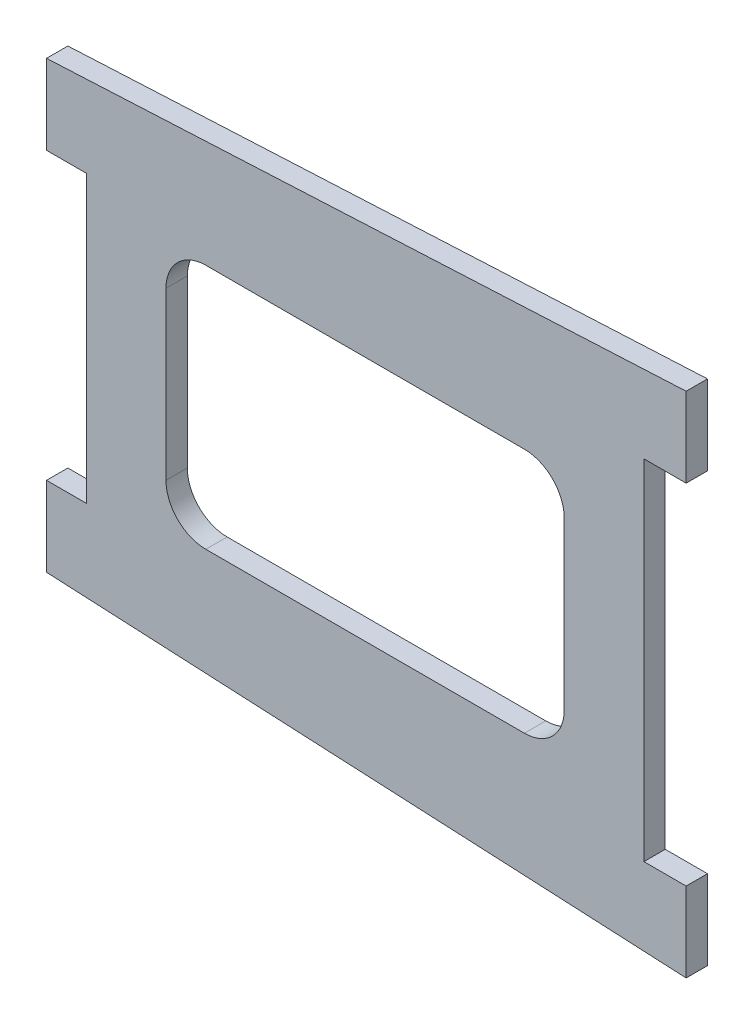
ISO-10303-21;
HEADER;
FILE_DESCRIPTION(('STEP AP214'),'2;1');
FILE_NAME('part.step','',(''),(''),'','','');
FILE_SCHEMA(('AUTOMOTIVE_DESIGN { 1 0 10303 214 1 1 1 1 }'));
ENDSEC;
DATA;
#1=APPLICATION_CONTEXT('core data for automotive mechanical design processes');
#2=APPLICATION_PROTOCOL_DEFINITION('international standard','automotive_design',2000,#1);
#3=PRODUCT_CONTEXT('',#1,'mechanical');
#4=PRODUCT('Part','Part','',(#3));
#5=PRODUCT_RELATED_PRODUCT_CATEGORY('part','',(#4));
#6=PRODUCT_DEFINITION_FORMATION('','',#4);
#7=PRODUCT_DEFINITION_CONTEXT('part definition',#1,'design');
#8=PRODUCT_DEFINITION('design','',#6,#7);
#9=PRODUCT_DEFINITION_SHAPE('','',#8);
#10=(LENGTH_UNIT() NAMED_UNIT(*) SI_UNIT(.MILLI.,.METRE.));
#11=(NAMED_UNIT(*) PLANE_ANGLE_UNIT() SI_UNIT($,.RADIAN.));
#12=(NAMED_UNIT(*) SI_UNIT($,.STERADIAN.) SOLID_ANGLE_UNIT());
#13=UNCERTAINTY_MEASURE_WITH_UNIT(LENGTH_MEASURE(1.E-05),#10,'distance_accuracy_value','');
#14=(GEOMETRIC_REPRESENTATION_CONTEXT(3) GLOBAL_UNCERTAINTY_ASSIGNED_CONTEXT((#13)) GLOBAL_UNIT_ASSIGNED_CONTEXT((#10,
#11,#12)) REPRESENTATION_CONTEXT('',''));
#15=CARTESIAN_POINT('',(0.,0.,0.));
#16=DIRECTION('',(0.,0.,1.));
#17=DIRECTION('',(1.,0.,0.));
#18=AXIS2_PLACEMENT_3D('',#15,#16,#17);
#19=CARTESIAN_POINT('',(0.,0.,3.4036));
#20=DIRECTION('',(0.,0.,-1.));
#21=DIRECTION('',(-1.,0.,0.));
#22=AXIS2_PLACEMENT_3D('',#19,#20,#21);
#23=PLANE('',#22);
#24=DIRECTION('',(-2.79741234551227E-13,1.,0.));
#25=VECTOR('',#24,1.);
#26=CARTESIAN_POINT('',(8689.6367599168,2967.0500559894,3.4036));
#27=LINE('',#26,#25);
#28=CARTESIAN_POINT('',(8689.6367599168,2967.0500559894,3.4036));
#29=VERTEX_POINT('',#28);
#30=CARTESIAN_POINT('',(8689.63675991679,2979.7500559894,3.4036));
#31=VERTEX_POINT('',#30);
#32=EDGE_CURVE('E239',#29,#31,#27,.T.);
#33=ORIENTED_EDGE('',*,*,#32,.T.);
#34=DIRECTION('',(-0.998786405241264,-0.0492515655104793,0.));
#35=VECTOR('',#34,1.);
#36=CARTESIAN_POINT('',(8689.63675991679,2979.7500559894,3.4036));
#37=LINE('',#36,#35);
#38=CARTESIAN_POINT('',(8587.6481929103,2974.7208559894,3.4036));
#39=VERTEX_POINT('',#38);
#40=EDGE_CURVE('E242',#31,#39,#37,.T.);
#41=ORIENTED_EDGE('',*,*,#40,.T.);
#42=DIRECTION('',(-2.79741234551227E-13,-1.,0.));
#43=VECTOR('',#42,1.);
#44=CARTESIAN_POINT('',(8587.64819291029,2962.0208559894,3.4036));
#45=LINE('',#44,#43);
#46=CARTESIAN_POINT('',(8587.64819291029,2962.0208559894,3.4036));
#47=VERTEX_POINT('',#46);
#48=EDGE_CURVE('E245',#39,#47,#45,.T.);
#49=ORIENTED_EDGE('',*,*,#48,.T.);
#50=DIRECTION('',(1.,0.,0.));
#51=VECTOR('',#50,1.);
#52=CARTESIAN_POINT('',(8587.64819291029,2962.0208559894,3.4036));
#53=LINE('',#52,#51);
#54=CARTESIAN_POINT('',(8593.99819291029,2962.0208559894,3.4036));
#55=VERTEX_POINT('',#54);
#56=EDGE_CURVE('E247',#47,#55,#53,.T.);
#57=ORIENTED_EDGE('',*,*,#56,.T.);
#58=DIRECTION('',(0.,-1.,0.));
#59=VECTOR('',#58,1.);
#60=CARTESIAN_POINT('',(8593.99819291029,2962.0208559894,3.4036));
#61=LINE('',#60,#59);
#62=CARTESIAN_POINT('',(8593.99819291029,2916.4532559894,3.4036));
#63=VERTEX_POINT('',#62);
#64=EDGE_CURVE('E249',#55,#63,#61,.T.);
#65=ORIENTED_EDGE('',*,*,#64,.T.);
#66=DIRECTION('',(-1.,0.,0.));
#67=VECTOR('',#66,1.);
#68=CARTESIAN_POINT('',(8587.64819291029,2916.4532559894,3.4036));
#69=LINE('',#68,#67);
#70=CARTESIAN_POINT('',(8587.64819291029,2916.4532559894,3.4036));
#71=VERTEX_POINT('',#70);
#72=EDGE_CURVE('E251',#63,#71,#69,.T.);
#73=ORIENTED_EDGE('',*,*,#72,.T.);
#74=DIRECTION('',(2.79741234551217E-13,-1.,0.));
#75=VECTOR('',#74,1.);
#76=CARTESIAN_POINT('',(8587.64819291029,2916.4532559894,3.4036));
#77=LINE('',#76,#75);
#78=CARTESIAN_POINT('',(8587.6481929103,2903.7532559894,3.4036));
#79=VERTEX_POINT('',#78);
#80=EDGE_CURVE('E253',#71,#79,#77,.T.);
#81=ORIENTED_EDGE('',*,*,#80,.T.);
#82=DIRECTION('',(0.998786405241264,-0.0492515655104793,0.));
#83=VECTOR('',#82,1.);
#84=CARTESIAN_POINT('',(8689.63675991679,2898.72405598939,3.4036));
#85=LINE('',#84,#83);
#86=CARTESIAN_POINT('',(8689.63675991679,2898.72405598939,3.4036));
#87=VERTEX_POINT('',#86);
#88=EDGE_CURVE('E255',#79,#87,#85,.T.);
#89=ORIENTED_EDGE('',*,*,#88,.T.);
#90=DIRECTION('',(2.79741234551217E-13,1.,0.));
#91=VECTOR('',#90,1.);
#92=CARTESIAN_POINT('',(8689.6367599168,2911.4240559894,3.4036));
#93=LINE('',#92,#91);
#94=CARTESIAN_POINT('',(8689.6367599168,2911.4240559894,3.4036));
#95=VERTEX_POINT('',#94);
#96=EDGE_CURVE('E257',#87,#95,#93,.T.);
#97=ORIENTED_EDGE('',*,*,#96,.T.);
#98=DIRECTION('',(-1.,0.,0.));
#99=VECTOR('',#98,1.);
#100=CARTESIAN_POINT('',(8689.6367599168,2911.4240559894,3.4036));
#101=LINE('',#100,#99);
#102=CARTESIAN_POINT('',(8682.8981929103,2911.4240559894,3.4036));
#103=VERTEX_POINT('',#102);
#104=EDGE_CURVE('E259',#95,#103,#101,.T.);
#105=ORIENTED_EDGE('',*,*,#104,.T.);
#106=DIRECTION('',(-1.27735723539367E-13,1.,0.));
#107=VECTOR('',#106,1.);
#108=CARTESIAN_POINT('',(8682.89819291029,2967.0500559894,3.4036));
#109=LINE('',#108,#107);
#110=CARTESIAN_POINT('',(8682.89819291029,2967.0500559894,3.4036));
#111=VERTEX_POINT('',#110);
#112=EDGE_CURVE('E261',#103,#111,#109,.T.);
#113=ORIENTED_EDGE('',*,*,#112,.T.);
#114=DIRECTION('',(1.,0.,0.));
#115=VECTOR('',#114,1.);
#116=CARTESIAN_POINT('',(8689.6367599168,2967.0500559894,3.4036));
#117=LINE('',#116,#115);
#118=EDGE_CURVE('E263',#111,#29,#117,.T.);
#119=ORIENTED_EDGE('',*,*,#118,.T.);
#120=EDGE_LOOP('',(#33,#41,#49,#57,#65,#73,#81,#89,#97,#105,#113,#119));
#121=FACE_BOUND('',#120,.T.);
#122=CARTESIAN_POINT('',(8613.0481929103,2952.4958559894,3.4036));
#123=DIRECTION('',(0.,0.,1.));
#124=DIRECTION('',(1.,0.,0.));
#125=AXIS2_PLACEMENT_3D('',#122,#123,#124);
#126=CIRCLE('',#125,6.34999999999963);
#127=CARTESIAN_POINT('',(8613.0481929103,2958.8458559894,3.4036));
#128=VERTEX_POINT('',#127);
#129=CARTESIAN_POINT('',(8606.69819291029,2952.4958559894,3.4036));
#130=VERTEX_POINT('',#129);
#131=EDGE_CURVE('E174',#128,#130,#126,.T.);
#132=ORIENTED_EDGE('',*,*,#131,.F.);
#133=DIRECTION('',(-1.,0.,0.));
#134=VECTOR('',#133,1.);
#135=CARTESIAN_POINT('',(8613.0481929103,2958.8458559894,3.4036));
#136=LINE('',#135,#134);
#137=CARTESIAN_POINT('',(8663.8481929103,2958.8458559894,3.4036));
#138=VERTEX_POINT('',#137);
#139=EDGE_CURVE('E207',#138,#128,#136,.T.);
#140=ORIENTED_EDGE('',*,*,#139,.F.);
#141=CARTESIAN_POINT('',(8663.8481929103,2952.4958559894,3.4036));
#142=DIRECTION('',(0.,0.,1.));
#143=DIRECTION('',(1.,0.,0.));
#144=AXIS2_PLACEMENT_3D('',#141,#142,#143);
#145=CIRCLE('',#144,6.34999999999963);
#146=CARTESIAN_POINT('',(8670.19819291029,2952.4958559894,3.4036));
#147=VERTEX_POINT('',#146);
#148=EDGE_CURVE('E205',#147,#138,#145,.T.);
#149=ORIENTED_EDGE('',*,*,#148,.F.);
#150=DIRECTION('',(0.,1.,0.));
#151=VECTOR('',#150,1.);
#152=CARTESIAN_POINT('',(8670.19819291029,2952.4958559894,3.4036));
#153=LINE('',#152,#151);
#154=CARTESIAN_POINT('',(8670.19819291029,2925.9782559894,3.4036));
#155=VERTEX_POINT('',#154);
#156=EDGE_CURVE('E203',#155,#147,#153,.T.);
#157=ORIENTED_EDGE('',*,*,#156,.F.);
#158=CARTESIAN_POINT('',(8663.8481929103,2925.9782559894,3.4036));
#159=DIRECTION('',(0.,0.,1.));
#160=DIRECTION('',(1.,0.,0.));
#161=AXIS2_PLACEMENT_3D('',#158,#159,#160);
#162=CIRCLE('',#161,6.34999999999986);
#163=CARTESIAN_POINT('',(8663.8481929103,2919.6282559894,3.4036));
#164=VERTEX_POINT('',#163);
#165=EDGE_CURVE('E201',#164,#155,#162,.T.);
#166=ORIENTED_EDGE('',*,*,#165,.F.);
#167=DIRECTION('',(1.,0.,0.));
#168=VECTOR('',#167,1.);
#169=CARTESIAN_POINT('',(8663.8481929103,2919.6282559894,3.4036));
#170=LINE('',#169,#168);
#171=CARTESIAN_POINT('',(8613.0481929103,2919.6282559894,3.4036));
#172=VERTEX_POINT('',#171);
#173=EDGE_CURVE('E197',#172,#164,#170,.T.);
#174=ORIENTED_EDGE('',*,*,#173,.F.);
#175=CARTESIAN_POINT('',(8613.0481929103,2925.9782559894,3.4036));
#176=DIRECTION('',(0.,0.,1.));
#177=DIRECTION('',(1.,0.,0.));
#178=AXIS2_PLACEMENT_3D('',#175,#176,#177);
#179=CIRCLE('',#178,6.34999999999986);
#180=CARTESIAN_POINT('',(8606.69819291029,2925.9782559894,3.4036));
#181=VERTEX_POINT('',#180);
#182=EDGE_CURVE('E195',#181,#172,#179,.T.);
#183=ORIENTED_EDGE('',*,*,#182,.F.);
#184=DIRECTION('',(0.,-1.,0.));
#185=VECTOR('',#184,1.);
#186=CARTESIAN_POINT('',(8606.69819291029,2952.4958559894,3.4036));
#187=LINE('',#186,#185);
#188=EDGE_CURVE('E182',#130,#181,#187,.T.);
#189=ORIENTED_EDGE('',*,*,#188,.F.);
#190=EDGE_LOOP('',(#132,#140,#149,#157,#166,#174,#183,#189));
#191=FACE_BOUND('',#190,.T.);
#192=ADVANCED_FACE('F37',(#121,#191),#23,.F.);
#193=CARTESIAN_POINT('',(0.,0.,0.));
#194=DIRECTION('',(0.,0.,-1.));
#195=DIRECTION('',(-1.,0.,0.));
#196=AXIS2_PLACEMENT_3D('',#193,#194,#195);
#197=PLANE('',#196);
#198=DIRECTION('',(-2.79741234551227E-13,1.,0.));
#199=VECTOR('',#198,1.);
#200=CARTESIAN_POINT('',(8689.6367599168,2967.0500559894,0.));
#201=LINE('',#200,#199);
#202=CARTESIAN_POINT('',(8689.6367599168,2967.0500559894,0.));
#203=VERTEX_POINT('',#202);
#204=CARTESIAN_POINT('',(8689.63675991679,2979.7500559894,0.));
#205=VERTEX_POINT('',#204);
#206=EDGE_CURVE('E190',#203,#205,#201,.T.);
#207=ORIENTED_EDGE('',*,*,#206,.F.);
#208=DIRECTION('',(1.,0.,0.));
#209=VECTOR('',#208,1.);
#210=CARTESIAN_POINT('',(8689.6367599168,2967.0500559894,0.));
#211=LINE('',#210,#209);
#212=CARTESIAN_POINT('',(8682.89819291029,2967.0500559894,0.));
#213=VERTEX_POINT('',#212);
#214=EDGE_CURVE('E243',#213,#203,#211,.T.);
#215=ORIENTED_EDGE('',*,*,#214,.F.);
#216=DIRECTION('',(-1.27735723539367E-13,1.,0.));
#217=VECTOR('',#216,1.);
#218=CARTESIAN_POINT('',(8682.89819291029,2967.0500559894,0.));
#219=LINE('',#218,#217);
#220=CARTESIAN_POINT('',(8682.8981929103,2911.4240559894,0.));
#221=VERTEX_POINT('',#220);
#222=EDGE_CURVE('E286',#221,#213,#219,.T.);
#223=ORIENTED_EDGE('',*,*,#222,.F.);
#224=DIRECTION('',(-1.,0.,0.));
#225=VECTOR('',#224,1.);
#226=CARTESIAN_POINT('',(8689.6367599168,2911.4240559894,0.));
#227=LINE('',#226,#225);
#228=CARTESIAN_POINT('',(8689.6367599168,2911.4240559894,0.));
#229=VERTEX_POINT('',#228);
#230=EDGE_CURVE('E284',#229,#221,#227,.T.);
#231=ORIENTED_EDGE('',*,*,#230,.F.);
#232=DIRECTION('',(2.79741234551217E-13,1.,0.));
#233=VECTOR('',#232,1.);
#234=CARTESIAN_POINT('',(8689.6367599168,2911.4240559894,0.));
#235=LINE('',#234,#233);
#236=CARTESIAN_POINT('',(8689.63675991679,2898.72405598939,0.));
#237=VERTEX_POINT('',#236);
#238=EDGE_CURVE('E282',#237,#229,#235,.T.);
#239=ORIENTED_EDGE('',*,*,#238,.F.);
#240=DIRECTION('',(0.998786405241264,-0.0492515655104793,0.));
#241=VECTOR('',#240,1.);
#242=CARTESIAN_POINT('',(8689.63675991679,2898.72405598939,0.));
#243=LINE('',#242,#241);
#244=CARTESIAN_POINT('',(8587.6481929103,2903.7532559894,0.));
#245=VERTEX_POINT('',#244);
#246=EDGE_CURVE('E280',#245,#237,#243,.T.);
#247=ORIENTED_EDGE('',*,*,#246,.F.);
#248=DIRECTION('',(2.79741234551217E-13,-1.,0.));
#249=VECTOR('',#248,1.);
#250=CARTESIAN_POINT('',(8587.64819291029,2916.4532559894,0.));
#251=LINE('',#250,#249);
#252=CARTESIAN_POINT('',(8587.64819291029,2916.4532559894,0.));
#253=VERTEX_POINT('',#252);
#254=EDGE_CURVE('E278',#253,#245,#251,.T.);
#255=ORIENTED_EDGE('',*,*,#254,.F.);
#256=DIRECTION('',(-1.,0.,0.));
#257=VECTOR('',#256,1.);
#258=CARTESIAN_POINT('',(8587.64819291029,2916.4532559894,0.));
#259=LINE('',#258,#257);
#260=CARTESIAN_POINT('',(8593.99819291029,2916.4532559894,0.));
#261=VERTEX_POINT('',#260);
#262=EDGE_CURVE('E276',#261,#253,#259,.T.);
#263=ORIENTED_EDGE('',*,*,#262,.F.);
#264=DIRECTION('',(0.,-1.,0.));
#265=VECTOR('',#264,1.);
#266=CARTESIAN_POINT('',(8593.99819291029,2962.0208559894,0.));
#267=LINE('',#266,#265);
#268=CARTESIAN_POINT('',(8593.99819291029,2962.0208559894,0.));
#269=VERTEX_POINT('',#268);
#270=EDGE_CURVE('E274',#269,#261,#267,.T.);
#271=ORIENTED_EDGE('',*,*,#270,.F.);
#272=DIRECTION('',(1.,0.,0.));
#273=VECTOR('',#272,1.);
#274=CARTESIAN_POINT('',(8587.64819291029,2962.0208559894,0.));
#275=LINE('',#274,#273);
#276=CARTESIAN_POINT('',(8587.64819291029,2962.0208559894,0.));
#277=VERTEX_POINT('',#276);
#278=EDGE_CURVE('E272',#277,#269,#275,.T.);
#279=ORIENTED_EDGE('',*,*,#278,.F.);
#280=DIRECTION('',(-2.79741234551227E-13,-1.,0.));
#281=VECTOR('',#280,1.);
#282=CARTESIAN_POINT('',(8587.64819291029,2962.0208559894,0.));
#283=LINE('',#282,#281);
#284=CARTESIAN_POINT('',(8587.6481929103,2974.7208559894,0.));
#285=VERTEX_POINT('',#284);
#286=EDGE_CURVE('E270',#285,#277,#283,.T.);
#287=ORIENTED_EDGE('',*,*,#286,.F.);
#288=DIRECTION('',(-0.998786405241264,-0.0492515655104793,0.));
#289=VECTOR('',#288,1.);
#290=CARTESIAN_POINT('',(8689.63675991679,2979.7500559894,0.));
#291=LINE('',#290,#289);
#292=EDGE_CURVE('E268',#205,#285,#291,.T.);
#293=ORIENTED_EDGE('',*,*,#292,.F.);
#294=EDGE_LOOP('',(#207,#215,#223,#231,#239,#247,#255,#263,#271,#279,#287,#293));
#295=FACE_BOUND('',#294,.T.);
#296=DIRECTION('',(-1.,0.,0.));
#297=VECTOR('',#296,1.);
#298=CARTESIAN_POINT('',(8613.0481929103,2958.8458559894,0.));
#299=LINE('',#298,#297);
#300=CARTESIAN_POINT('',(8663.8481929103,2958.8458559894,0.));
#301=VERTEX_POINT('',#300);
#302=CARTESIAN_POINT('',(8613.0481929103,2958.8458559894,0.));
#303=VERTEX_POINT('',#302);
#304=EDGE_CURVE('E183',#301,#303,#299,.T.);
#305=ORIENTED_EDGE('',*,*,#304,.T.);
#306=CARTESIAN_POINT('',(8613.0481929103,2952.4958559894,0.));
#307=DIRECTION('',(0.,0.,1.));
#308=DIRECTION('',(1.,0.,0.));
#309=AXIS2_PLACEMENT_3D('',#306,#307,#308);
#310=CIRCLE('',#309,6.34999999999963);
#311=CARTESIAN_POINT('',(8606.69819291029,2952.4958559894,0.));
#312=VERTEX_POINT('',#311);
#313=EDGE_CURVE('E60',#303,#312,#310,.T.);
#314=ORIENTED_EDGE('',*,*,#313,.T.);
#315=DIRECTION('',(0.,-1.,0.));
#316=VECTOR('',#315,1.);
#317=CARTESIAN_POINT('',(8606.69819291029,2952.4958559894,0.));
#318=LINE('',#317,#316);
#319=CARTESIAN_POINT('',(8606.69819291029,2925.9782559894,0.));
#320=VERTEX_POINT('',#319);
#321=EDGE_CURVE('E189',#312,#320,#318,.T.);
#322=ORIENTED_EDGE('',*,*,#321,.T.);
#323=CARTESIAN_POINT('',(8613.0481929103,2925.9782559894,0.));
#324=DIRECTION('',(0.,0.,1.));
#325=DIRECTION('',(1.,0.,0.));
#326=AXIS2_PLACEMENT_3D('',#323,#324,#325);
#327=CIRCLE('',#326,6.34999999999986);
#328=CARTESIAN_POINT('',(8613.0481929103,2919.6282559894,0.));
#329=VERTEX_POINT('',#328);
#330=EDGE_CURVE('E211',#320,#329,#327,.T.);
#331=ORIENTED_EDGE('',*,*,#330,.T.);
#332=DIRECTION('',(1.,0.,0.));
#333=VECTOR('',#332,1.);
#334=CARTESIAN_POINT('',(8663.8481929103,2919.6282559894,0.));
#335=LINE('',#334,#333);
#336=CARTESIAN_POINT('',(8663.8481929103,2919.6282559894,0.));
#337=VERTEX_POINT('',#336);
#338=EDGE_CURVE('E214',#329,#337,#335,.T.);
#339=ORIENTED_EDGE('',*,*,#338,.T.);
#340=CARTESIAN_POINT('',(8663.8481929103,2925.9782559894,0.));
#341=DIRECTION('',(0.,0.,1.));
#342=DIRECTION('',(1.,0.,0.));
#343=AXIS2_PLACEMENT_3D('',#340,#341,#342);
#344=CIRCLE('',#343,6.34999999999986);
#345=CARTESIAN_POINT('',(8670.19819291029,2925.9782559894,0.));
#346=VERTEX_POINT('',#345);
#347=EDGE_CURVE('E217',#337,#346,#344,.T.);
#348=ORIENTED_EDGE('',*,*,#347,.T.);
#349=DIRECTION('',(0.,1.,0.));
#350=VECTOR('',#349,1.);
#351=CARTESIAN_POINT('',(8670.19819291029,2952.4958559894,0.));
#352=LINE('',#351,#350);
#353=CARTESIAN_POINT('',(8670.19819291029,2952.4958559894,0.));
#354=VERTEX_POINT('',#353);
#355=EDGE_CURVE('E220',#346,#354,#352,.T.);
#356=ORIENTED_EDGE('',*,*,#355,.T.);
#357=CARTESIAN_POINT('',(8663.8481929103,2952.4958559894,0.));
#358=DIRECTION('',(0.,0.,1.));
#359=DIRECTION('',(1.,0.,0.));
#360=AXIS2_PLACEMENT_3D('',#357,#358,#359);
#361=CIRCLE('',#360,6.34999999999963);
#362=EDGE_CURVE('E223',#354,#301,#361,.T.);
#363=ORIENTED_EDGE('',*,*,#362,.T.);
#364=EDGE_LOOP('',(#305,#314,#322,#331,#339,#348,#356,#363));
#365=FACE_BOUND('',#364,.T.);
#366=ADVANCED_FACE('F328',(#295,#365),#197,.T.);
#367=CARTESIAN_POINT('',(8689.6367599168,2967.0500559894,3.4036));
#368=DIRECTION('',(-1.,-2.79741234551227E-13,0.));
#369=DIRECTION('',(2.79741234551227E-13,-1.,0.));
#370=AXIS2_PLACEMENT_3D('',#367,#368,#369);
#371=PLANE('',#370);
#372=ORIENTED_EDGE('',*,*,#206,.T.);
#373=DIRECTION('',(0.,0.,-1.));
#374=VECTOR('',#373,1.);
#375=CARTESIAN_POINT('',(8689.63675991679,2979.7500559894,3.4036));
#376=LINE('',#375,#374);
#377=EDGE_CURVE('E11',#31,#205,#376,.T.);
#378=ORIENTED_EDGE('',*,*,#377,.F.);
#379=ORIENTED_EDGE('',*,*,#32,.F.);
#380=DIRECTION('',(0.,0.,-1.));
#381=VECTOR('',#380,1.);
#382=CARTESIAN_POINT('',(8689.6367599168,2967.0500559894,3.4036));
#383=LINE('',#382,#381);
#384=EDGE_CURVE('E265',#29,#203,#383,.T.);
#385=ORIENTED_EDGE('',*,*,#384,.T.);
#386=EDGE_LOOP('',(#372,#378,#379,#385));
#387=FACE_BOUND('',#386,.T.);
#388=ADVANCED_FACE('F39',(#387),#371,.F.);
#389=CARTESIAN_POINT('',(8689.63675991679,2979.7500559894,3.4036));
#390=DIRECTION('',(0.0492515655104793,-0.998786405241264,0.));
#391=DIRECTION('',(0.998786405241264,0.0492515655104793,0.));
#392=AXIS2_PLACEMENT_3D('',#389,#390,#391);
#393=PLANE('',#392);
#394=ORIENTED_EDGE('',*,*,#292,.T.);
#395=DIRECTION('',(0.,0.,-1.));
#396=VECTOR('',#395,1.);
#397=CARTESIAN_POINT('',(8587.6481929103,2974.7208559894,3.4036));
#398=LINE('',#397,#396);
#399=EDGE_CURVE('E45',#39,#285,#398,.T.);
#400=ORIENTED_EDGE('',*,*,#399,.F.);
#401=ORIENTED_EDGE('',*,*,#40,.F.);
#402=ORIENTED_EDGE('',*,*,#377,.T.);
#403=EDGE_LOOP('',(#394,#400,#401,#402));
#404=FACE_BOUND('',#403,.T.);
#405=ADVANCED_FACE('F345',(#404),#393,.F.);
#406=CARTESIAN_POINT('',(8587.64819291029,2962.0208559894,3.4036));
#407=DIRECTION('',(1.,-2.79741234551227E-13,0.));
#408=DIRECTION('',(2.79741234551227E-13,1.,0.));
#409=AXIS2_PLACEMENT_3D('',#406,#407,#408);
#410=PLANE('',#409);
#411=ORIENTED_EDGE('',*,*,#286,.T.);
#412=DIRECTION('',(0.,0.,-1.));
#413=VECTOR('',#412,1.);
#414=CARTESIAN_POINT('',(8587.64819291029,2962.0208559894,3.4036));
#415=LINE('',#414,#413);
#416=EDGE_CURVE('E315',#47,#277,#415,.T.);
#417=ORIENTED_EDGE('',*,*,#416,.F.);
#418=ORIENTED_EDGE('',*,*,#48,.F.);
#419=ORIENTED_EDGE('',*,*,#399,.T.);
#420=EDGE_LOOP('',(#411,#417,#418,#419));
#421=FACE_BOUND('',#420,.T.);
#422=ADVANCED_FACE('F322',(#421),#410,.F.);
#423=CARTESIAN_POINT('',(8587.64819291029,2962.0208559894,3.4036));
#424=DIRECTION('',(0.,1.,0.));
#425=DIRECTION('',(0.,0.,1.));
#426=AXIS2_PLACEMENT_3D('',#423,#424,#425);
#427=PLANE('',#426);
#428=ORIENTED_EDGE('',*,*,#278,.T.);
#429=DIRECTION('',(0.,0.,-1.));
#430=VECTOR('',#429,1.);
#431=CARTESIAN_POINT('',(8593.99819291029,2962.0208559894,3.4036));
#432=LINE('',#431,#430);
#433=EDGE_CURVE('E312',#55,#269,#432,.T.);
#434=ORIENTED_EDGE('',*,*,#433,.F.);
#435=ORIENTED_EDGE('',*,*,#56,.F.);
#436=ORIENTED_EDGE('',*,*,#416,.T.);
#437=EDGE_LOOP('',(#428,#434,#435,#436));
#438=FACE_BOUND('',#437,.T.);
#439=ADVANCED_FACE('F334',(#438),#427,.F.);
#440=CARTESIAN_POINT('',(8593.99819291029,2962.0208559894,3.4036));
#441=DIRECTION('',(1.,0.,0.));
#442=DIRECTION('',(0.,0.,-1.));
#443=AXIS2_PLACEMENT_3D('',#440,#441,#442);
#444=PLANE('',#443);
#445=ORIENTED_EDGE('',*,*,#270,.T.);
#446=DIRECTION('',(0.,0.,-1.));
#447=VECTOR('',#446,1.);
#448=CARTESIAN_POINT('',(8593.99819291029,2916.4532559894,3.4036));
#449=LINE('',#448,#447);
#450=EDGE_CURVE('E309',#63,#261,#449,.T.);
#451=ORIENTED_EDGE('',*,*,#450,.F.);
#452=ORIENTED_EDGE('',*,*,#64,.F.);
#453=ORIENTED_EDGE('',*,*,#433,.T.);
#454=EDGE_LOOP('',(#445,#451,#452,#453));
#455=FACE_BOUND('',#454,.T.);
#456=ADVANCED_FACE('F338',(#455),#444,.F.);
#457=CARTESIAN_POINT('',(8587.64819291029,2916.4532559894,3.4036));
#458=DIRECTION('',(0.,-1.,0.));
#459=DIRECTION('',(0.,0.,-1.));
#460=AXIS2_PLACEMENT_3D('',#457,#458,#459);
#461=PLANE('',#460);
#462=ORIENTED_EDGE('',*,*,#262,.T.);
#463=DIRECTION('',(0.,0.,-1.));
#464=VECTOR('',#463,1.);
#465=CARTESIAN_POINT('',(8587.64819291029,2916.4532559894,3.4036));
#466=LINE('',#465,#464);
#467=EDGE_CURVE('E306',#71,#253,#466,.T.);
#468=ORIENTED_EDGE('',*,*,#467,.F.);
#469=ORIENTED_EDGE('',*,*,#72,.F.);
#470=ORIENTED_EDGE('',*,*,#450,.T.);
#471=EDGE_LOOP('',(#462,#468,#469,#470));
#472=FACE_BOUND('',#471,.T.);
#473=ADVANCED_FACE('F378',(#472),#461,.F.);
#474=CARTESIAN_POINT('',(8587.64819291029,2916.4532559894,3.4036));
#475=DIRECTION('',(1.,2.79741234551217E-13,0.));
#476=DIRECTION('',(-2.79741234551217E-13,1.,0.));
#477=AXIS2_PLACEMENT_3D('',#474,#475,#476);
#478=PLANE('',#477);
#479=ORIENTED_EDGE('',*,*,#254,.T.);
#480=DIRECTION('',(0.,0.,-1.));
#481=VECTOR('',#480,1.);
#482=CARTESIAN_POINT('',(8587.6481929103,2903.7532559894,3.4036));
#483=LINE('',#482,#481);
#484=EDGE_CURVE('E303',#79,#245,#483,.T.);
#485=ORIENTED_EDGE('',*,*,#484,.F.);
#486=ORIENTED_EDGE('',*,*,#80,.F.);
#487=ORIENTED_EDGE('',*,*,#467,.T.);
#488=EDGE_LOOP('',(#479,#485,#486,#487));
#489=FACE_BOUND('',#488,.T.);
#490=ADVANCED_FACE('F376',(#489),#478,.F.);
#491=CARTESIAN_POINT('',(8689.63675991679,2898.72405598939,3.4036));
#492=DIRECTION('',(0.0492515655104793,0.998786405241264,0.));
#493=DIRECTION('',(-0.998786405241264,0.0492515655104793,0.));
#494=AXIS2_PLACEMENT_3D('',#491,#492,#493);
#495=PLANE('',#494);
#496=ORIENTED_EDGE('',*,*,#246,.T.);
#497=DIRECTION('',(0.,0.,-1.));
#498=VECTOR('',#497,1.);
#499=CARTESIAN_POINT('',(8689.63675991679,2898.72405598939,3.4036));
#500=LINE('',#499,#498);
#501=EDGE_CURVE('E300',#87,#237,#500,.T.);
#502=ORIENTED_EDGE('',*,*,#501,.F.);
#503=ORIENTED_EDGE('',*,*,#88,.F.);
#504=ORIENTED_EDGE('',*,*,#484,.T.);
#505=EDGE_LOOP('',(#496,#502,#503,#504));
#506=FACE_BOUND('',#505,.T.);
#507=ADVANCED_FACE('F372',(#506),#495,.F.);
#508=CARTESIAN_POINT('',(8689.6367599168,2911.4240559894,3.4036));
#509=DIRECTION('',(-1.,2.79741234551217E-13,0.));
#510=DIRECTION('',(-2.79741234551217E-13,-1.,0.));
#511=AXIS2_PLACEMENT_3D('',#508,#509,#510);
#512=PLANE('',#511);
#513=ORIENTED_EDGE('',*,*,#238,.T.);
#514=DIRECTION('',(0.,0.,-1.));
#515=VECTOR('',#514,1.);
#516=CARTESIAN_POINT('',(8689.6367599168,2911.4240559894,3.4036));
#517=LINE('',#516,#515);
#518=EDGE_CURVE('E297',#95,#229,#517,.T.);
#519=ORIENTED_EDGE('',*,*,#518,.F.);
#520=ORIENTED_EDGE('',*,*,#96,.F.);
#521=ORIENTED_EDGE('',*,*,#501,.T.);
#522=EDGE_LOOP('',(#513,#519,#520,#521));
#523=FACE_BOUND('',#522,.T.);
#524=ADVANCED_FACE('F367',(#523),#512,.F.);
#525=CARTESIAN_POINT('',(8689.6367599168,2911.4240559894,3.4036));
#526=DIRECTION('',(0.,-1.,0.));
#527=DIRECTION('',(0.,0.,-1.));
#528=AXIS2_PLACEMENT_3D('',#525,#526,#527);
#529=PLANE('',#528);
#530=ORIENTED_EDGE('',*,*,#230,.T.);
#531=DIRECTION('',(0.,0.,-1.));
#532=VECTOR('',#531,1.);
#533=CARTESIAN_POINT('',(8682.8981929103,2911.4240559894,3.4036));
#534=LINE('',#533,#532);
#535=EDGE_CURVE('E294',#103,#221,#534,.T.);
#536=ORIENTED_EDGE('',*,*,#535,.F.);
#537=ORIENTED_EDGE('',*,*,#104,.F.);
#538=ORIENTED_EDGE('',*,*,#518,.T.);
#539=EDGE_LOOP('',(#530,#536,#537,#538));
#540=FACE_BOUND('',#539,.T.);
#541=ADVANCED_FACE('F361',(#540),#529,.F.);
#542=CARTESIAN_POINT('',(8682.89819291029,2967.0500559894,3.4036));
#543=DIRECTION('',(-1.,-1.27735723539367E-13,0.));
#544=DIRECTION('',(1.27735723539367E-13,-1.,0.));
#545=AXIS2_PLACEMENT_3D('',#542,#543,#544);
#546=PLANE('',#545);
#547=ORIENTED_EDGE('',*,*,#222,.T.);
#548=DIRECTION('',(0.,0.,-1.));
#549=VECTOR('',#548,1.);
#550=CARTESIAN_POINT('',(8682.89819291029,2967.0500559894,3.4036));
#551=LINE('',#550,#549);
#552=EDGE_CURVE('E291',#111,#213,#551,.T.);
#553=ORIENTED_EDGE('',*,*,#552,.F.);
#554=ORIENTED_EDGE('',*,*,#112,.F.);
#555=ORIENTED_EDGE('',*,*,#535,.T.);
#556=EDGE_LOOP('',(#547,#553,#554,#555));
#557=FACE_BOUND('',#556,.T.);
#558=ADVANCED_FACE('F357',(#557),#546,.F.);
#559=CARTESIAN_POINT('',(8689.6367599168,2967.0500559894,3.4036));
#560=DIRECTION('',(0.,1.,0.));
#561=DIRECTION('',(0.,0.,1.));
#562=AXIS2_PLACEMENT_3D('',#559,#560,#561);
#563=PLANE('',#562);
#564=ORIENTED_EDGE('',*,*,#214,.T.);
#565=ORIENTED_EDGE('',*,*,#384,.F.);
#566=ORIENTED_EDGE('',*,*,#118,.F.);
#567=ORIENTED_EDGE('',*,*,#552,.T.);
#568=EDGE_LOOP('',(#564,#565,#566,#567));
#569=FACE_BOUND('',#568,.T.);
#570=ADVANCED_FACE('F352',(#569),#563,.F.);
#571=CARTESIAN_POINT('',(8613.0481929103,2952.4958559894,3.4036));
#572=DIRECTION('',(0.,0.,-1.));
#573=DIRECTION('',(-1.,0.,0.));
#574=AXIS2_PLACEMENT_3D('',#571,#572,#573);
#575=CYLINDRICAL_SURFACE('',#574,6.34999999999963);
#576=ORIENTED_EDGE('',*,*,#313,.F.);
#577=DIRECTION('',(0.,0.,-1.));
#578=VECTOR('',#577,1.);
#579=CARTESIAN_POINT('',(8613.0481929103,2958.8458559894,3.4036));
#580=LINE('',#579,#578);
#581=EDGE_CURVE('E178',#128,#303,#580,.T.);
#582=ORIENTED_EDGE('',*,*,#581,.F.);
#583=ORIENTED_EDGE('',*,*,#131,.T.);
#584=DIRECTION('',(0.,0.,-1.));
#585=VECTOR('',#584,1.);
#586=CARTESIAN_POINT('',(8606.69819291029,2952.4958559894,3.4036));
#587=LINE('',#586,#585);
#588=EDGE_CURVE('E177',#130,#312,#587,.T.);
#589=ORIENTED_EDGE('',*,*,#588,.T.);
#590=EDGE_LOOP('',(#576,#582,#583,#589));
#591=FACE_BOUND('',#590,.T.);
#592=ADVANCED_FACE('F176',(#591),#575,.F.);
#593=CARTESIAN_POINT('',(8606.69819291029,2952.4958559894,3.4036));
#594=DIRECTION('',(1.,0.,0.));
#595=DIRECTION('',(0.,0.,-1.));
#596=AXIS2_PLACEMENT_3D('',#593,#594,#595);
#597=PLANE('',#596);
#598=ORIENTED_EDGE('',*,*,#321,.F.);
#599=ORIENTED_EDGE('',*,*,#588,.F.);
#600=ORIENTED_EDGE('',*,*,#188,.T.);
#601=DIRECTION('',(0.,0.,-1.));
#602=VECTOR('',#601,1.);
#603=CARTESIAN_POINT('',(8606.69819291029,2925.9782559894,3.4036));
#604=LINE('',#603,#602);
#605=EDGE_CURVE('E191',#181,#320,#604,.T.);
#606=ORIENTED_EDGE('',*,*,#605,.T.);
#607=EDGE_LOOP('',(#598,#599,#600,#606));
#608=FACE_BOUND('',#607,.T.);
#609=ADVANCED_FACE('F186',(#608),#597,.T.);
#610=CARTESIAN_POINT('',(8613.0481929103,2925.9782559894,3.4036));
#611=DIRECTION('',(0.,0.,-1.));
#612=DIRECTION('',(-1.,0.,0.));
#613=AXIS2_PLACEMENT_3D('',#610,#611,#612);
#614=CYLINDRICAL_SURFACE('',#613,6.34999999999986);
#615=ORIENTED_EDGE('',*,*,#330,.F.);
#616=ORIENTED_EDGE('',*,*,#605,.F.);
#617=ORIENTED_EDGE('',*,*,#182,.T.);
#618=DIRECTION('',(0.,0.,-1.));
#619=VECTOR('',#618,1.);
#620=CARTESIAN_POINT('',(8613.0481929103,2919.6282559894,3.4036));
#621=LINE('',#620,#619);
#622=EDGE_CURVE('E236',#172,#329,#621,.T.);
#623=ORIENTED_EDGE('',*,*,#622,.T.);
#624=EDGE_LOOP('',(#615,#616,#617,#623));
#625=FACE_BOUND('',#624,.T.);
#626=ADVANCED_FACE('F436',(#625),#614,.F.);
#627=CARTESIAN_POINT('',(8663.8481929103,2919.6282559894,3.4036));
#628=DIRECTION('',(0.,1.,0.));
#629=DIRECTION('',(0.,0.,1.));
#630=AXIS2_PLACEMENT_3D('',#627,#628,#629);
#631=PLANE('',#630);
#632=ORIENTED_EDGE('',*,*,#338,.F.);
#633=ORIENTED_EDGE('',*,*,#622,.F.);
#634=ORIENTED_EDGE('',*,*,#173,.T.);
#635=DIRECTION('',(0.,0.,-1.));
#636=VECTOR('',#635,1.);
#637=CARTESIAN_POINT('',(8663.8481929103,2919.6282559894,3.4036));
#638=LINE('',#637,#636);
#639=EDGE_CURVE('E234',#164,#337,#638,.T.);
#640=ORIENTED_EDGE('',*,*,#639,.T.);
#641=EDGE_LOOP('',(#632,#633,#634,#640));
#642=FACE_BOUND('',#641,.T.);
#643=ADVANCED_FACE('F442',(#642),#631,.T.);
#644=CARTESIAN_POINT('',(8663.8481929103,2925.9782559894,3.4036));
#645=DIRECTION('',(0.,0.,-1.));
#646=DIRECTION('',(-1.,0.,0.));
#647=AXIS2_PLACEMENT_3D('',#644,#645,#646);
#648=CYLINDRICAL_SURFACE('',#647,6.34999999999986);
#649=ORIENTED_EDGE('',*,*,#347,.F.);
#650=ORIENTED_EDGE('',*,*,#639,.F.);
#651=ORIENTED_EDGE('',*,*,#165,.T.);
#652=DIRECTION('',(0.,0.,-1.));
#653=VECTOR('',#652,1.);
#654=CARTESIAN_POINT('',(8670.19819291029,2925.9782559894,3.4036));
#655=LINE('',#654,#653);
#656=EDGE_CURVE('E232',#155,#346,#655,.T.);
#657=ORIENTED_EDGE('',*,*,#656,.T.);
#658=EDGE_LOOP('',(#649,#650,#651,#657));
#659=FACE_BOUND('',#658,.T.);
#660=ADVANCED_FACE('F450',(#659),#648,.F.);
#661=CARTESIAN_POINT('',(8670.19819291029,2952.4958559894,3.4036));
#662=DIRECTION('',(-1.,0.,0.));
#663=DIRECTION('',(0.,0.,1.));
#664=AXIS2_PLACEMENT_3D('',#661,#662,#663);
#665=PLANE('',#664);
#666=ORIENTED_EDGE('',*,*,#355,.F.);
#667=ORIENTED_EDGE('',*,*,#656,.F.);
#668=ORIENTED_EDGE('',*,*,#156,.T.);
#669=DIRECTION('',(0.,0.,-1.));
#670=VECTOR('',#669,1.);
#671=CARTESIAN_POINT('',(8670.19819291029,2952.4958559894,3.4036));
#672=LINE('',#671,#670);
#673=EDGE_CURVE('E230',#147,#354,#672,.T.);
#674=ORIENTED_EDGE('',*,*,#673,.T.);
#675=EDGE_LOOP('',(#666,#667,#668,#674));
#676=FACE_BOUND('',#675,.T.);
#677=ADVANCED_FACE('F458',(#676),#665,.T.);
#678=CARTESIAN_POINT('',(8663.8481929103,2952.4958559894,3.4036));
#679=DIRECTION('',(0.,0.,-1.));
#680=DIRECTION('',(-1.,0.,0.));
#681=AXIS2_PLACEMENT_3D('',#678,#679,#680);
#682=CYLINDRICAL_SURFACE('',#681,6.34999999999963);
#683=ORIENTED_EDGE('',*,*,#362,.F.);
#684=ORIENTED_EDGE('',*,*,#673,.F.);
#685=ORIENTED_EDGE('',*,*,#148,.T.);
#686=DIRECTION('',(0.,0.,-1.));
#687=VECTOR('',#686,1.);
#688=CARTESIAN_POINT('',(8663.8481929103,2958.8458559894,3.4036));
#689=LINE('',#688,#687);
#690=EDGE_CURVE('E52',#138,#301,#689,.T.);
#691=ORIENTED_EDGE('',*,*,#690,.T.);
#692=EDGE_LOOP('',(#683,#684,#685,#691));
#693=FACE_BOUND('',#692,.T.);
#694=ADVANCED_FACE('F466',(#693),#682,.F.);
#695=CARTESIAN_POINT('',(8613.0481929103,2958.8458559894,3.4036));
#696=DIRECTION('',(0.,-1.,0.));
#697=DIRECTION('',(0.,0.,-1.));
#698=AXIS2_PLACEMENT_3D('',#695,#696,#697);
#699=PLANE('',#698);
#700=ORIENTED_EDGE('',*,*,#304,.F.);
#701=ORIENTED_EDGE('',*,*,#690,.F.);
#702=ORIENTED_EDGE('',*,*,#139,.T.);
#703=ORIENTED_EDGE('',*,*,#581,.T.);
#704=EDGE_LOOP('',(#700,#701,#702,#703));
#705=FACE_BOUND('',#704,.T.);
#706=ADVANCED_FACE('F474',(#705),#699,.T.);
#707=CLOSED_SHELL('',(#192,#366,#388,#405,#422,#439,#456,#473,#490,#507,#524,#541,#558,#570,
#592,#609,#626,#643,#660,#677,#694,#706));
#708=MANIFOLD_SOLID_BREP('B2',#707);
#709=ADVANCED_BREP_SHAPE_REPRESENTATION('',(#18,#708),#14);
#710=SHAPE_DEFINITION_REPRESENTATION(#9,#709);
ENDSEC;
END-ISO-10303-21;
